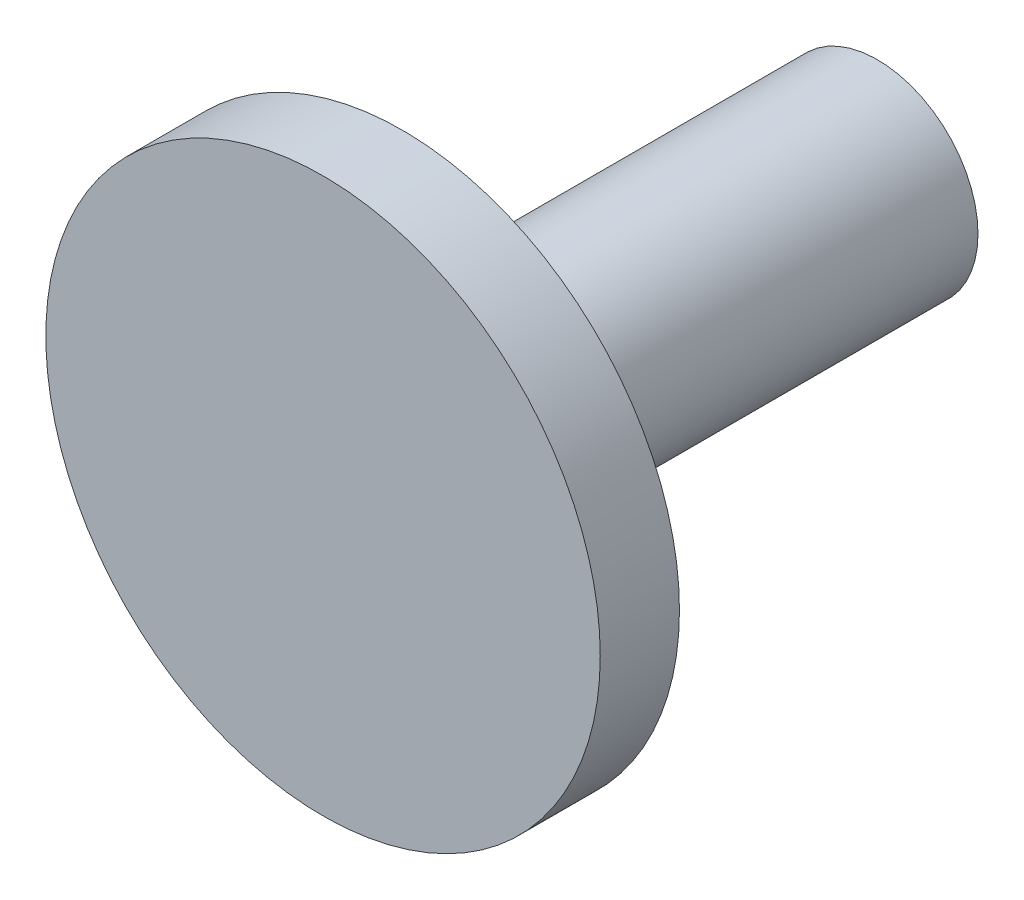
ISO-10303-21;
HEADER;
FILE_DESCRIPTION(('STEP AP214'),'2;1');
FILE_NAME('part.step','',(''),(''),'','','');
FILE_SCHEMA(('AUTOMOTIVE_DESIGN { 1 0 10303 214 1 1 1 1 }'));
ENDSEC;
DATA;
#1=APPLICATION_CONTEXT('core data for automotive mechanical design processes');
#2=APPLICATION_PROTOCOL_DEFINITION('international standard','automotive_design',2000,#1);
#3=PRODUCT_CONTEXT('',#1,'mechanical');
#4=PRODUCT('Part','Part','',(#3));
#5=PRODUCT_RELATED_PRODUCT_CATEGORY('part','',(#4));
#6=PRODUCT_DEFINITION_FORMATION('','',#4);
#7=PRODUCT_DEFINITION_CONTEXT('part definition',#1,'design');
#8=PRODUCT_DEFINITION('design','',#6,#7);
#9=PRODUCT_DEFINITION_SHAPE('','',#8);
#10=(LENGTH_UNIT() NAMED_UNIT(*) SI_UNIT(.MILLI.,.METRE.));
#11=(NAMED_UNIT(*) PLANE_ANGLE_UNIT() SI_UNIT($,.RADIAN.));
#12=(NAMED_UNIT(*) SI_UNIT($,.STERADIAN.) SOLID_ANGLE_UNIT());
#13=UNCERTAINTY_MEASURE_WITH_UNIT(LENGTH_MEASURE(1.E-05),#10,'distance_accuracy_value','');
#14=(GEOMETRIC_REPRESENTATION_CONTEXT(3) GLOBAL_UNCERTAINTY_ASSIGNED_CONTEXT((#13)) GLOBAL_UNIT_ASSIGNED_CONTEXT((#10,
#11,#12)) REPRESENTATION_CONTEXT('',''));
#15=CARTESIAN_POINT('',(0.,0.,0.));
#16=DIRECTION('',(0.,0.,1.));
#17=DIRECTION('',(1.,0.,0.));
#18=AXIS2_PLACEMENT_3D('',#15,#16,#17);
#19=CARTESIAN_POINT('',(0.,0.,5.));
#20=DIRECTION('',(0.,0.,-1.));
#21=DIRECTION('',(-1.,0.,0.));
#22=AXIS2_PLACEMENT_3D('',#19,#20,#21);
#23=CYLINDRICAL_SURFACE('',#22,17.5);
#24=CARTESIAN_POINT('',(0.,0.,5.));
#25=DIRECTION('',(0.,0.,1.));
#26=DIRECTION('',(1.,0.,0.));
#27=AXIS2_PLACEMENT_3D('',#24,#25,#26);
#28=CIRCLE('',#27,17.5);
#29=CARTESIAN_POINT('',(17.5,0.,5.));
#30=VERTEX_POINT('',#29);
#31=EDGE_CURVE('E10',#30,#30,#28,.T.);
#32=ORIENTED_EDGE('',*,*,#31,.F.);
#33=EDGE_LOOP('',(#32));
#34=FACE_BOUND('',#33,.T.);
#35=CARTESIAN_POINT('',(0.,0.,0.));
#36=DIRECTION('',(0.,0.,1.));
#37=DIRECTION('',(1.,0.,0.));
#38=AXIS2_PLACEMENT_3D('',#35,#36,#37);
#39=CIRCLE('',#38,17.5);
#40=CARTESIAN_POINT('',(17.5,0.,0.));
#41=VERTEX_POINT('',#40);
#42=EDGE_CURVE('E34',#41,#41,#39,.T.);
#43=ORIENTED_EDGE('',*,*,#42,.T.);
#44=EDGE_LOOP('',(#43));
#45=FACE_BOUND('',#44,.T.);
#46=ADVANCED_FACE('F31',(#34,#45),#23,.T.);
#47=CARTESIAN_POINT('',(0.,0.,5.));
#48=DIRECTION('',(0.,0.,1.));
#49=DIRECTION('',(1.,0.,0.));
#50=AXIS2_PLACEMENT_3D('',#47,#48,#49);
#51=PLANE('',#50);
#52=ORIENTED_EDGE('',*,*,#31,.T.);
#53=EDGE_LOOP('',(#52));
#54=FACE_BOUND('',#53,.T.);
#55=ADVANCED_FACE('F61',(#54),#51,.T.);
#56=CARTESIAN_POINT('',(0.,0.,0.));
#57=DIRECTION('',(0.,0.,1.));
#58=DIRECTION('',(1.,0.,0.));
#59=AXIS2_PLACEMENT_3D('',#56,#57,#58);
#60=PLANE('',#59);
#61=CARTESIAN_POINT('',(0.,0.,0.));
#62=DIRECTION('',(0.,0.,1.));
#63=DIRECTION('',(1.,0.,0.));
#64=AXIS2_PLACEMENT_3D('',#61,#62,#63);
#65=CIRCLE('',#64,6.345);
#66=CARTESIAN_POINT('',(6.345,0.,0.));
#67=VERTEX_POINT('',#66);
#68=EDGE_CURVE('E43',#67,#67,#65,.T.);
#69=ORIENTED_EDGE('',*,*,#68,.T.);
#70=EDGE_LOOP('',(#69));
#71=FACE_BOUND('',#70,.T.);
#72=ORIENTED_EDGE('',*,*,#42,.F.);
#73=EDGE_LOOP('',(#72));
#74=FACE_BOUND('',#73,.T.);
#75=ADVANCED_FACE('F58',(#71,#74),#60,.F.);
#76=CARTESIAN_POINT('',(0.,0.,-30.));
#77=DIRECTION('',(0.,0.,1.));
#78=DIRECTION('',(1.,0.,0.));
#79=AXIS2_PLACEMENT_3D('',#76,#77,#78);
#80=CYLINDRICAL_SURFACE('',#79,6.345);
#81=CARTESIAN_POINT('',(0.,0.,-30.));
#82=DIRECTION('',(0.,0.,1.));
#83=DIRECTION('',(1.,0.,0.));
#84=AXIS2_PLACEMENT_3D('',#81,#82,#83);
#85=CIRCLE('',#84,6.345);
#86=CARTESIAN_POINT('',(6.345,0.,-30.));
#87=VERTEX_POINT('',#86);
#88=EDGE_CURVE('E41',#87,#87,#85,.T.);
#89=ORIENTED_EDGE('',*,*,#88,.T.);
#90=EDGE_LOOP('',(#89));
#91=FACE_BOUND('',#90,.T.);
#92=ORIENTED_EDGE('',*,*,#68,.F.);
#93=EDGE_LOOP('',(#92));
#94=FACE_BOUND('',#93,.T.);
#95=ADVANCED_FACE('F49',(#91,#94),#80,.T.);
#96=CARTESIAN_POINT('',(0.,0.,-30.));
#97=DIRECTION('',(0.,0.,1.));
#98=DIRECTION('',(1.,0.,0.));
#99=AXIS2_PLACEMENT_3D('',#96,#97,#98);
#100=PLANE('',#99);
#101=ORIENTED_EDGE('',*,*,#88,.F.);
#102=EDGE_LOOP('',(#101));
#103=FACE_BOUND('',#102,.T.);
#104=ADVANCED_FACE('F52',(#103),#100,.F.);
#105=CLOSED_SHELL('',(#46,#55,#75,#95,#104));
#106=MANIFOLD_SOLID_BREP('B2',#105);
#107=ADVANCED_BREP_SHAPE_REPRESENTATION('',(#18,#106),#14);
#108=SHAPE_DEFINITION_REPRESENTATION(#9,#107);
ENDSEC;
END-ISO-10303-21;
